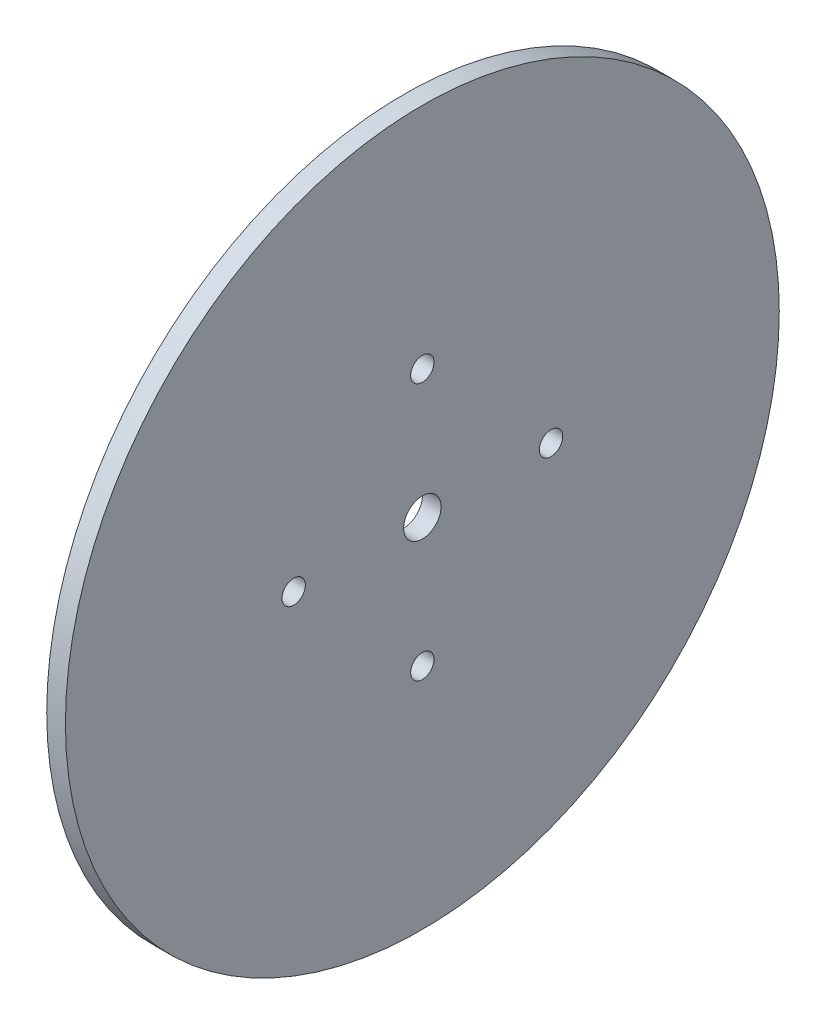
ISO-10303-21;
HEADER;
FILE_DESCRIPTION(('STEP AP214'),'2;1');
FILE_NAME('part.step','',(''),(''),'','','');
FILE_SCHEMA(('AUTOMOTIVE_DESIGN { 1 0 10303 214 1 1 1 1 }'));
ENDSEC;
DATA;
#1=APPLICATION_CONTEXT('core data for automotive mechanical design processes');
#2=APPLICATION_PROTOCOL_DEFINITION('international standard','automotive_design',2000,#1);
#3=PRODUCT_CONTEXT('',#1,'mechanical');
#4=PRODUCT('Part','Part','',(#3));
#5=PRODUCT_RELATED_PRODUCT_CATEGORY('part','',(#4));
#6=PRODUCT_DEFINITION_FORMATION('','',#4);
#7=PRODUCT_DEFINITION_CONTEXT('part definition',#1,'design');
#8=PRODUCT_DEFINITION('design','',#6,#7);
#9=PRODUCT_DEFINITION_SHAPE('','',#8);
#10=(LENGTH_UNIT() NAMED_UNIT(*) SI_UNIT(.MILLI.,.METRE.));
#11=(NAMED_UNIT(*) PLANE_ANGLE_UNIT() SI_UNIT($,.RADIAN.));
#12=(NAMED_UNIT(*) SI_UNIT($,.STERADIAN.) SOLID_ANGLE_UNIT());
#13=UNCERTAINTY_MEASURE_WITH_UNIT(LENGTH_MEASURE(1.E-05),#10,'distance_accuracy_value','');
#14=(GEOMETRIC_REPRESENTATION_CONTEXT(3) GLOBAL_UNCERTAINTY_ASSIGNED_CONTEXT((#13)) GLOBAL_UNIT_ASSIGNED_CONTEXT((#10,
#11,#12)) REPRESENTATION_CONTEXT('',''));
#15=CARTESIAN_POINT('',(0.,0.,0.));
#16=DIRECTION('',(0.,0.,1.));
#17=DIRECTION('',(1.,0.,0.));
#18=AXIS2_PLACEMENT_3D('',#15,#16,#17);
#19=CARTESIAN_POINT('',(4.,0.,0.));
#20=DIRECTION('',(1.,0.,0.));
#21=DIRECTION('',(0.,0.,-1.));
#22=AXIS2_PLACEMENT_3D('',#19,#20,#21);
#23=PLANE('',#22);
#24=CARTESIAN_POINT('',(4.,-27.5,0.));
#25=DIRECTION('',(1.,0.,0.));
#26=DIRECTION('',(0.,0.,-1.));
#27=AXIS2_PLACEMENT_3D('',#24,#25,#26);
#28=CIRCLE('',#27,2.5);
#29=CARTESIAN_POINT('',(4.,-27.5,-2.5));
#30=VERTEX_POINT('',#29);
#31=EDGE_CURVE('E58',#30,#30,#28,.T.);
#32=ORIENTED_EDGE('',*,*,#31,.F.);
#33=EDGE_LOOP('',(#32));
#34=FACE_BOUND('',#33,.T.);
#35=CARTESIAN_POINT('',(4.,0.,0.));
#36=DIRECTION('',(1.,0.,0.));
#37=DIRECTION('',(0.,0.,-1.));
#38=AXIS2_PLACEMENT_3D('',#35,#36,#37);
#39=CIRCLE('',#38,4.);
#40=CARTESIAN_POINT('',(4.,0.,-4.));
#41=VERTEX_POINT('',#40);
#42=EDGE_CURVE('E46',#41,#41,#39,.T.);
#43=ORIENTED_EDGE('',*,*,#42,.F.);
#44=EDGE_LOOP('',(#43));
#45=FACE_BOUND('',#44,.T.);
#46=CARTESIAN_POINT('',(4.,0.,0.));
#47=DIRECTION('',(1.,0.,0.));
#48=DIRECTION('',(0.,0.,-1.));
#49=AXIS2_PLACEMENT_3D('',#46,#47,#48);
#50=CIRCLE('',#49,76.29);
#51=CARTESIAN_POINT('',(4.,0.,-76.29));
#52=VERTEX_POINT('',#51);
#53=EDGE_CURVE('E10',#52,#52,#50,.T.);
#54=ORIENTED_EDGE('',*,*,#53,.T.);
#55=EDGE_LOOP('',(#54));
#56=FACE_BOUND('',#55,.T.);
#57=CARTESIAN_POINT('',(4.,27.5,0.));
#58=DIRECTION('',(1.,0.,0.));
#59=DIRECTION('',(0.,0.,-1.));
#60=AXIS2_PLACEMENT_3D('',#57,#58,#59);
#61=CIRCLE('',#60,2.5);
#62=CARTESIAN_POINT('',(4.,27.5,-2.5));
#63=VERTEX_POINT('',#62);
#64=EDGE_CURVE('E41',#63,#63,#61,.T.);
#65=ORIENTED_EDGE('',*,*,#64,.F.);
#66=EDGE_LOOP('',(#65));
#67=FACE_BOUND('',#66,.T.);
#68=CARTESIAN_POINT('',(4.,0.,-27.5));
#69=DIRECTION('',(1.,0.,0.));
#70=DIRECTION('',(0.,0.,-1.));
#71=AXIS2_PLACEMENT_3D('',#68,#69,#70);
#72=CIRCLE('',#71,2.5);
#73=CARTESIAN_POINT('',(4.,0.,-30.));
#74=VERTEX_POINT('',#73);
#75=EDGE_CURVE('E52',#74,#74,#72,.T.);
#76=ORIENTED_EDGE('',*,*,#75,.F.);
#77=EDGE_LOOP('',(#76));
#78=FACE_BOUND('',#77,.T.);
#79=CARTESIAN_POINT('',(4.,0.,27.5));
#80=DIRECTION('',(1.,0.,0.));
#81=DIRECTION('',(0.,0.,-1.));
#82=AXIS2_PLACEMENT_3D('',#79,#80,#81);
#83=CIRCLE('',#82,2.5);
#84=CARTESIAN_POINT('',(4.,0.,25.));
#85=VERTEX_POINT('',#84);
#86=EDGE_CURVE('E64',#85,#85,#83,.T.);
#87=ORIENTED_EDGE('',*,*,#86,.F.);
#88=EDGE_LOOP('',(#87));
#89=FACE_BOUND('',#88,.T.);
#90=ADVANCED_FACE('F30',(#34,#45,#56,#67,#78,#89),#23,.T.);
#91=CARTESIAN_POINT('',(0.,0.,0.));
#92=DIRECTION('',(1.,0.,0.));
#93=DIRECTION('',(0.,0.,-1.));
#94=AXIS2_PLACEMENT_3D('',#91,#92,#93);
#95=PLANE('',#94);
#96=CARTESIAN_POINT('',(0.,0.,0.));
#97=DIRECTION('',(1.,0.,0.));
#98=DIRECTION('',(0.,0.,-1.));
#99=AXIS2_PLACEMENT_3D('',#96,#97,#98);
#100=CIRCLE('',#99,76.29);
#101=CARTESIAN_POINT('',(0.,0.,-76.29));
#102=VERTEX_POINT('',#101);
#103=EDGE_CURVE('E34',#102,#102,#100,.T.);
#104=ORIENTED_EDGE('',*,*,#103,.F.);
#105=EDGE_LOOP('',(#104));
#106=FACE_BOUND('',#105,.T.);
#107=CARTESIAN_POINT('',(0.,27.5,0.));
#108=DIRECTION('',(1.,0.,0.));
#109=DIRECTION('',(0.,0.,-1.));
#110=AXIS2_PLACEMENT_3D('',#107,#108,#109);
#111=CIRCLE('',#110,2.5);
#112=CARTESIAN_POINT('',(0.,27.5,-2.5));
#113=VERTEX_POINT('',#112);
#114=EDGE_CURVE('E43',#113,#113,#111,.T.);
#115=ORIENTED_EDGE('',*,*,#114,.T.);
#116=EDGE_LOOP('',(#115));
#117=FACE_BOUND('',#116,.T.);
#118=CARTESIAN_POINT('',(0.,0.,0.));
#119=DIRECTION('',(1.,0.,0.));
#120=DIRECTION('',(0.,0.,-1.));
#121=AXIS2_PLACEMENT_3D('',#118,#119,#120);
#122=CIRCLE('',#121,4.);
#123=CARTESIAN_POINT('',(0.,0.,-4.));
#124=VERTEX_POINT('',#123);
#125=EDGE_CURVE('E49',#124,#124,#122,.T.);
#126=ORIENTED_EDGE('',*,*,#125,.T.);
#127=EDGE_LOOP('',(#126));
#128=FACE_BOUND('',#127,.T.);
#129=CARTESIAN_POINT('',(0.,0.,-27.5));
#130=DIRECTION('',(1.,0.,0.));
#131=DIRECTION('',(0.,0.,-1.));
#132=AXIS2_PLACEMENT_3D('',#129,#130,#131);
#133=CIRCLE('',#132,2.5);
#134=CARTESIAN_POINT('',(0.,0.,-30.));
#135=VERTEX_POINT('',#134);
#136=EDGE_CURVE('E55',#135,#135,#133,.T.);
#137=ORIENTED_EDGE('',*,*,#136,.T.);
#138=EDGE_LOOP('',(#137));
#139=FACE_BOUND('',#138,.T.);
#140=CARTESIAN_POINT('',(0.,-27.5,0.));
#141=DIRECTION('',(1.,0.,0.));
#142=DIRECTION('',(0.,0.,-1.));
#143=AXIS2_PLACEMENT_3D('',#140,#141,#142);
#144=CIRCLE('',#143,2.5);
#145=CARTESIAN_POINT('',(0.,-27.5,-2.5));
#146=VERTEX_POINT('',#145);
#147=EDGE_CURVE('E61',#146,#146,#144,.T.);
#148=ORIENTED_EDGE('',*,*,#147,.T.);
#149=EDGE_LOOP('',(#148));
#150=FACE_BOUND('',#149,.T.);
#151=CARTESIAN_POINT('',(0.,0.,27.5));
#152=DIRECTION('',(1.,0.,0.));
#153=DIRECTION('',(0.,0.,-1.));
#154=AXIS2_PLACEMENT_3D('',#151,#152,#153);
#155=CIRCLE('',#154,2.5);
#156=CARTESIAN_POINT('',(0.,0.,25.));
#157=VERTEX_POINT('',#156);
#158=EDGE_CURVE('E67',#157,#157,#155,.T.);
#159=ORIENTED_EDGE('',*,*,#158,.T.);
#160=EDGE_LOOP('',(#159));
#161=FACE_BOUND('',#160,.T.);
#162=ADVANCED_FACE('F77',(#106,#117,#128,#139,#150,#161),#95,.F.);
#163=CARTESIAN_POINT('',(4.,0.,0.));
#164=DIRECTION('',(-1.,0.,0.));
#165=DIRECTION('',(0.,0.,1.));
#166=AXIS2_PLACEMENT_3D('',#163,#164,#165);
#167=CYLINDRICAL_SURFACE('',#166,76.29);
#168=ORIENTED_EDGE('',*,*,#53,.F.);
#169=EDGE_LOOP('',(#168));
#170=FACE_BOUND('',#169,.T.);
#171=ORIENTED_EDGE('',*,*,#103,.T.);
#172=EDGE_LOOP('',(#171));
#173=FACE_BOUND('',#172,.T.);
#174=ADVANCED_FACE('F32',(#170,#173),#167,.T.);
#175=CARTESIAN_POINT('',(4.,27.5,0.));
#176=DIRECTION('',(-1.,0.,0.));
#177=DIRECTION('',(0.,0.,1.));
#178=AXIS2_PLACEMENT_3D('',#175,#176,#177);
#179=CYLINDRICAL_SURFACE('',#178,2.5);
#180=ORIENTED_EDGE('',*,*,#64,.T.);
#181=EDGE_LOOP('',(#180));
#182=FACE_BOUND('',#181,.T.);
#183=ORIENTED_EDGE('',*,*,#114,.F.);
#184=EDGE_LOOP('',(#183));
#185=FACE_BOUND('',#184,.T.);
#186=ADVANCED_FACE('F87',(#182,#185),#179,.F.);
#187=CARTESIAN_POINT('',(4.,0.,0.));
#188=DIRECTION('',(-1.,0.,0.));
#189=DIRECTION('',(0.,0.,1.));
#190=AXIS2_PLACEMENT_3D('',#187,#188,#189);
#191=CYLINDRICAL_SURFACE('',#190,4.);
#192=ORIENTED_EDGE('',*,*,#42,.T.);
#193=EDGE_LOOP('',(#192));
#194=FACE_BOUND('',#193,.T.);
#195=ORIENTED_EDGE('',*,*,#125,.F.);
#196=EDGE_LOOP('',(#195));
#197=FACE_BOUND('',#196,.T.);
#198=ADVANCED_FACE('F90',(#194,#197),#191,.F.);
#199=CARTESIAN_POINT('',(4.,0.,-27.5));
#200=DIRECTION('',(-1.,0.,0.));
#201=DIRECTION('',(0.,0.,1.));
#202=AXIS2_PLACEMENT_3D('',#199,#200,#201);
#203=CYLINDRICAL_SURFACE('',#202,2.5);
#204=ORIENTED_EDGE('',*,*,#75,.T.);
#205=EDGE_LOOP('',(#204));
#206=FACE_BOUND('',#205,.T.);
#207=ORIENTED_EDGE('',*,*,#136,.F.);
#208=EDGE_LOOP('',(#207));
#209=FACE_BOUND('',#208,.T.);
#210=ADVANCED_FACE('F94',(#206,#209),#203,.F.);
#211=CARTESIAN_POINT('',(4.,-27.5,0.));
#212=DIRECTION('',(-1.,0.,0.));
#213=DIRECTION('',(0.,0.,1.));
#214=AXIS2_PLACEMENT_3D('',#211,#212,#213);
#215=CYLINDRICAL_SURFACE('',#214,2.5);
#216=ORIENTED_EDGE('',*,*,#31,.T.);
#217=EDGE_LOOP('',(#216));
#218=FACE_BOUND('',#217,.T.);
#219=ORIENTED_EDGE('',*,*,#147,.F.);
#220=EDGE_LOOP('',(#219));
#221=FACE_BOUND('',#220,.T.);
#222=ADVANCED_FACE('F98',(#218,#221),#215,.F.);
#223=CARTESIAN_POINT('',(4.,0.,27.5));
#224=DIRECTION('',(-1.,0.,0.));
#225=DIRECTION('',(0.,0.,1.));
#226=AXIS2_PLACEMENT_3D('',#223,#224,#225);
#227=CYLINDRICAL_SURFACE('',#226,2.5);
#228=ORIENTED_EDGE('',*,*,#86,.T.);
#229=EDGE_LOOP('',(#228));
#230=FACE_BOUND('',#229,.T.);
#231=ORIENTED_EDGE('',*,*,#158,.F.);
#232=EDGE_LOOP('',(#231));
#233=FACE_BOUND('',#232,.T.);
#234=ADVANCED_FACE('F73',(#230,#233),#227,.F.);
#235=CLOSED_SHELL('',(#90,#162,#174,#186,#198,#210,#222,#234));
#236=MANIFOLD_SOLID_BREP('B2',#235);
#237=ADVANCED_BREP_SHAPE_REPRESENTATION('',(#18,#236),#14);
#238=SHAPE_DEFINITION_REPRESENTATION(#9,#237);
ENDSEC;
END-ISO-10303-21;
